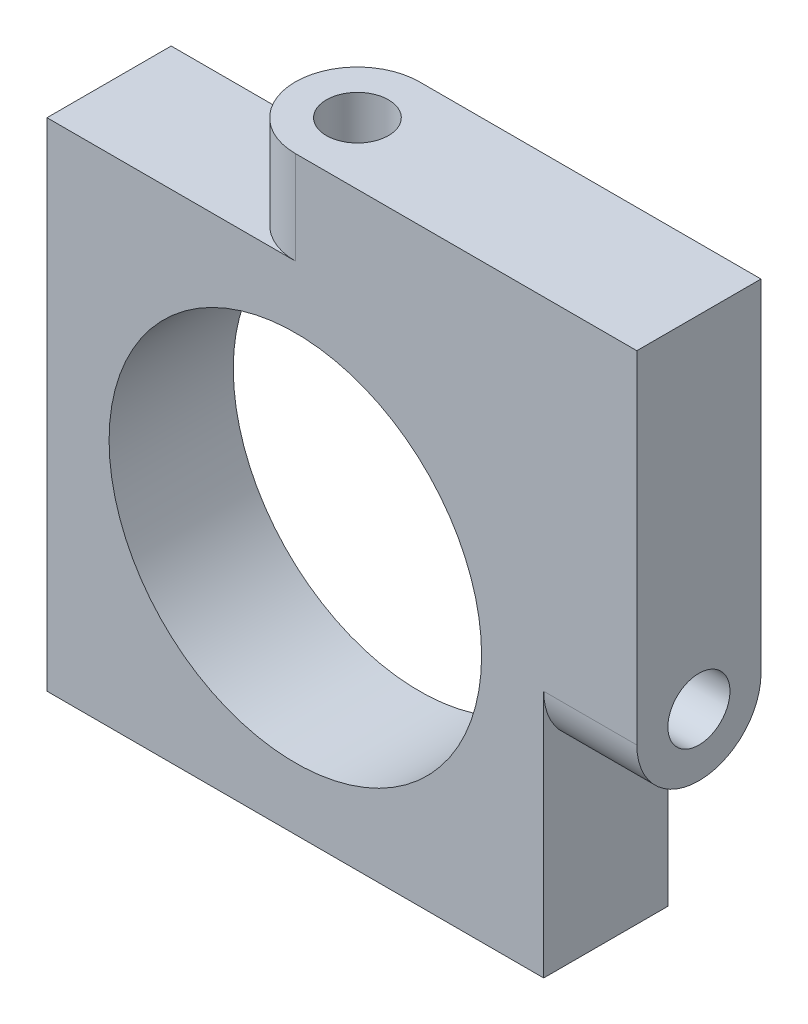
ISO-10303-21;
HEADER;
FILE_DESCRIPTION(('STEP AP214'),'2;1');
FILE_NAME('part.step','',(''),(''),'','','');
FILE_SCHEMA(('AUTOMOTIVE_DESIGN { 1 0 10303 214 1 1 1 1 }'));
ENDSEC;
DATA;
#1=APPLICATION_CONTEXT('core data for automotive mechanical design processes');
#2=APPLICATION_PROTOCOL_DEFINITION('international standard','automotive_design',2000,#1);
#3=PRODUCT_CONTEXT('',#1,'mechanical');
#4=PRODUCT('Part','Part','',(#3));
#5=PRODUCT_RELATED_PRODUCT_CATEGORY('part','',(#4));
#6=PRODUCT_DEFINITION_FORMATION('','',#4);
#7=PRODUCT_DEFINITION_CONTEXT('part definition',#1,'design');
#8=PRODUCT_DEFINITION('design','',#6,#7);
#9=PRODUCT_DEFINITION_SHAPE('','',#8);
#10=(LENGTH_UNIT() NAMED_UNIT(*) SI_UNIT(.MILLI.,.METRE.));
#11=(NAMED_UNIT(*) PLANE_ANGLE_UNIT() SI_UNIT($,.RADIAN.));
#12=(NAMED_UNIT(*) SI_UNIT($,.STERADIAN.) SOLID_ANGLE_UNIT());
#13=UNCERTAINTY_MEASURE_WITH_UNIT(LENGTH_MEASURE(1.E-05),#10,'distance_accuracy_value','');
#14=(GEOMETRIC_REPRESENTATION_CONTEXT(3) GLOBAL_UNCERTAINTY_ASSIGNED_CONTEXT((#13)) GLOBAL_UNIT_ASSIGNED_CONTEXT((#10,
#11,#12)) REPRESENTATION_CONTEXT('',''));
#15=CARTESIAN_POINT('',(0.,0.,0.));
#16=DIRECTION('',(0.,0.,1.));
#17=DIRECTION('',(1.,0.,0.));
#18=AXIS2_PLACEMENT_3D('',#15,#16,#17);
#19=CARTESIAN_POINT('',(0.,0.,25.4));
#20=DIRECTION('',(0.,0.,-1.));
#21=DIRECTION('',(-1.,0.,0.));
#22=AXIS2_PLACEMENT_3D('',#19,#20,#21);
#23=PLANE('',#22);
#24=DIRECTION('',(0.,-1.,0.));
#25=VECTOR('',#24,1.);
#26=CARTESIAN_POINT('',(0.,0.,25.4));
#27=LINE('',#26,#25);
#28=CARTESIAN_POINT('',(0.,101.6,25.4));
#29=VERTEX_POINT('',#28);
#30=CARTESIAN_POINT('',(0.,0.,25.4));
#31=VERTEX_POINT('',#30);
#32=EDGE_CURVE('E155',#29,#31,#27,.T.);
#33=ORIENTED_EDGE('',*,*,#32,.T.);
#34=DIRECTION('',(1.,0.,0.));
#35=VECTOR('',#34,1.);
#36=CARTESIAN_POINT('',(0.,0.,25.4));
#37=LINE('',#36,#35);
#38=CARTESIAN_POINT('',(101.6,0.,25.4));
#39=VERTEX_POINT('',#38);
#40=EDGE_CURVE('E157',#31,#39,#37,.T.);
#41=ORIENTED_EDGE('',*,*,#40,.T.);
#42=DIRECTION('',(0.,1.,0.));
#43=VECTOR('',#42,1.);
#44=CARTESIAN_POINT('',(101.6,0.,25.4));
#45=LINE('',#44,#43);
#46=CARTESIAN_POINT('',(101.6,50.8,25.4));
#47=VERTEX_POINT('',#46);
#48=EDGE_CURVE('E123',#39,#47,#45,.T.);
#49=ORIENTED_EDGE('',*,*,#48,.T.);
#50=DIRECTION('',(-1.,0.,0.));
#51=VECTOR('',#50,1.);
#52=CARTESIAN_POINT('',(120.65,50.8,25.4));
#53=LINE('',#52,#51);
#54=CARTESIAN_POINT('',(120.65,50.8,25.4));
#55=VERTEX_POINT('',#54);
#56=EDGE_CURVE('E103',#55,#47,#53,.T.);
#57=ORIENTED_EDGE('',*,*,#56,.F.);
#58=DIRECTION('',(0.,-1.,0.));
#59=VECTOR('',#58,1.);
#60=CARTESIAN_POINT('',(120.65,0.,25.4));
#61=LINE('',#60,#59);
#62=CARTESIAN_POINT('',(120.65,120.65,25.4));
#63=VERTEX_POINT('',#62);
#64=EDGE_CURVE('E110',#63,#55,#61,.T.);
#65=ORIENTED_EDGE('',*,*,#64,.F.);
#66=DIRECTION('',(1.,0.,0.));
#67=VECTOR('',#66,1.);
#68=CARTESIAN_POINT('',(0.,120.65,25.4));
#69=LINE('',#68,#67);
#70=CARTESIAN_POINT('',(50.8,120.65,25.4));
#71=VERTEX_POINT('',#70);
#72=EDGE_CURVE('E139',#71,#63,#69,.T.);
#73=ORIENTED_EDGE('',*,*,#72,.F.);
#74=DIRECTION('',(0.,-1.,0.));
#75=VECTOR('',#74,1.);
#76=CARTESIAN_POINT('',(50.8,120.65,25.4));
#77=LINE('',#76,#75);
#78=CARTESIAN_POINT('',(50.8,101.6,25.4));
#79=VERTEX_POINT('',#78);
#80=EDGE_CURVE('E140',#71,#79,#77,.T.);
#81=ORIENTED_EDGE('',*,*,#80,.T.);
#82=DIRECTION('',(-1.,0.,0.));
#83=VECTOR('',#82,1.);
#84=CARTESIAN_POINT('',(0.,101.6,25.4));
#85=LINE('',#84,#83);
#86=EDGE_CURVE('E161',#79,#29,#85,.T.);
#87=ORIENTED_EDGE('',*,*,#86,.T.);
#88=EDGE_LOOP('',(#33,#41,#49,#57,#65,#73,#81,#87));
#89=FACE_BOUND('',#88,.T.);
#90=CARTESIAN_POINT('',(50.8,50.8,25.4));
#91=DIRECTION('',(0.,0.,1.));
#92=DIRECTION('',(1.,0.,0.));
#93=AXIS2_PLACEMENT_3D('',#90,#91,#92);
#94=CIRCLE('',#93,38.1);
#95=CARTESIAN_POINT('',(88.9,50.8,25.4));
#96=VERTEX_POINT('',#95);
#97=EDGE_CURVE('E149',#96,#96,#94,.T.);
#98=ORIENTED_EDGE('',*,*,#97,.F.);
#99=EDGE_LOOP('',(#98));
#100=FACE_BOUND('',#99,.T.);
#101=ADVANCED_FACE('F33',(#89,#100),#23,.F.);
#102=CARTESIAN_POINT('',(0.,0.,0.));
#103=DIRECTION('',(0.,0.,-1.));
#104=DIRECTION('',(-1.,0.,0.));
#105=AXIS2_PLACEMENT_3D('',#102,#103,#104);
#106=PLANE('',#105);
#107=DIRECTION('',(0.,-1.,0.));
#108=VECTOR('',#107,1.);
#109=CARTESIAN_POINT('',(0.,0.,0.));
#110=LINE('',#109,#108);
#111=CARTESIAN_POINT('',(0.,101.6,0.));
#112=VERTEX_POINT('',#111);
#113=CARTESIAN_POINT('',(0.,0.,0.));
#114=VERTEX_POINT('',#113);
#115=EDGE_CURVE('E152',#112,#114,#110,.T.);
#116=ORIENTED_EDGE('',*,*,#115,.F.);
#117=DIRECTION('',(-1.,0.,0.));
#118=VECTOR('',#117,1.);
#119=CARTESIAN_POINT('',(0.,101.6,0.));
#120=LINE('',#119,#118);
#121=CARTESIAN_POINT('',(50.8,101.6,0.));
#122=VERTEX_POINT('',#121);
#123=EDGE_CURVE('E158',#122,#112,#120,.T.);
#124=ORIENTED_EDGE('',*,*,#123,.F.);
#125=DIRECTION('',(0.,-1.,0.));
#126=VECTOR('',#125,1.);
#127=CARTESIAN_POINT('',(50.8,120.65,0.));
#128=LINE('',#127,#126);
#129=CARTESIAN_POINT('',(50.8,120.65,0.));
#130=VERTEX_POINT('',#129);
#131=EDGE_CURVE('E145',#130,#122,#128,.T.);
#132=ORIENTED_EDGE('',*,*,#131,.F.);
#133=DIRECTION('',(-1.,0.,0.));
#134=VECTOR('',#133,1.);
#135=CARTESIAN_POINT('',(0.,120.65,0.));
#136=LINE('',#135,#134);
#137=CARTESIAN_POINT('',(120.65,120.65,0.));
#138=VERTEX_POINT('',#137);
#139=EDGE_CURVE('E134',#138,#130,#136,.T.);
#140=ORIENTED_EDGE('',*,*,#139,.F.);
#141=DIRECTION('',(0.,1.,0.));
#142=VECTOR('',#141,1.);
#143=CARTESIAN_POINT('',(120.65,0.,0.));
#144=LINE('',#143,#142);
#145=CARTESIAN_POINT('',(120.65,50.8,0.));
#146=VERTEX_POINT('',#145);
#147=EDGE_CURVE('E109',#146,#138,#144,.T.);
#148=ORIENTED_EDGE('',*,*,#147,.F.);
#149=DIRECTION('',(-1.,0.,0.));
#150=VECTOR('',#149,1.);
#151=CARTESIAN_POINT('',(120.65,50.8,0.));
#152=LINE('',#151,#150);
#153=CARTESIAN_POINT('',(101.6,50.8,0.));
#154=VERTEX_POINT('',#153);
#155=EDGE_CURVE('E105',#146,#154,#152,.T.);
#156=ORIENTED_EDGE('',*,*,#155,.T.);
#157=DIRECTION('',(0.,1.,0.));
#158=VECTOR('',#157,1.);
#159=CARTESIAN_POINT('',(101.6,0.,0.));
#160=LINE('',#159,#158);
#161=CARTESIAN_POINT('',(101.6,0.,0.));
#162=VERTEX_POINT('',#161);
#163=EDGE_CURVE('E168',#162,#154,#160,.T.);
#164=ORIENTED_EDGE('',*,*,#163,.F.);
#165=DIRECTION('',(1.,0.,0.));
#166=VECTOR('',#165,1.);
#167=CARTESIAN_POINT('',(0.,0.,0.));
#168=LINE('',#167,#166);
#169=EDGE_CURVE('E166',#114,#162,#168,.T.);
#170=ORIENTED_EDGE('',*,*,#169,.F.);
#171=EDGE_LOOP('',(#116,#124,#132,#140,#148,#156,#164,#170));
#172=FACE_BOUND('',#171,.T.);
#173=CARTESIAN_POINT('',(50.8,50.8,0.));
#174=DIRECTION('',(0.,0.,1.));
#175=DIRECTION('',(1.,0.,0.));
#176=AXIS2_PLACEMENT_3D('',#173,#174,#175);
#177=CIRCLE('',#176,38.1);
#178=CARTESIAN_POINT('',(88.9,50.8,0.));
#179=VERTEX_POINT('',#178);
#180=EDGE_CURVE('E148',#179,#179,#177,.T.);
#181=ORIENTED_EDGE('',*,*,#180,.T.);
#182=EDGE_LOOP('',(#181));
#183=FACE_BOUND('',#182,.T.);
#184=ADVANCED_FACE('F179',(#172,#183),#106,.T.);
#185=CARTESIAN_POINT('',(0.,0.,25.4));
#186=DIRECTION('',(1.,0.,0.));
#187=DIRECTION('',(0.,0.,-1.));
#188=AXIS2_PLACEMENT_3D('',#185,#186,#187);
#189=PLANE('',#188);
#190=ORIENTED_EDGE('',*,*,#115,.T.);
#191=DIRECTION('',(0.,0.,-1.));
#192=VECTOR('',#191,1.);
#193=CARTESIAN_POINT('',(0.,0.,25.4));
#194=LINE('',#193,#192);
#195=EDGE_CURVE('E11',#31,#114,#194,.T.);
#196=ORIENTED_EDGE('',*,*,#195,.F.);
#197=ORIENTED_EDGE('',*,*,#32,.F.);
#198=DIRECTION('',(0.,0.,-1.));
#199=VECTOR('',#198,1.);
#200=CARTESIAN_POINT('',(0.,101.6,25.4));
#201=LINE('',#200,#199);
#202=EDGE_CURVE('E163',#29,#112,#201,.T.);
#203=ORIENTED_EDGE('',*,*,#202,.T.);
#204=EDGE_LOOP('',(#190,#196,#197,#203));
#205=FACE_BOUND('',#204,.T.);
#206=ADVANCED_FACE('F35',(#205),#189,.F.);
#207=CARTESIAN_POINT('',(0.,0.,25.4));
#208=DIRECTION('',(0.,1.,0.));
#209=DIRECTION('',(0.,0.,1.));
#210=AXIS2_PLACEMENT_3D('',#207,#208,#209);
#211=PLANE('',#210);
#212=ORIENTED_EDGE('',*,*,#169,.T.);
#213=DIRECTION('',(0.,0.,-1.));
#214=VECTOR('',#213,1.);
#215=CARTESIAN_POINT('',(101.6,0.,25.4));
#216=LINE('',#215,#214);
#217=EDGE_CURVE('E41',#39,#162,#216,.T.);
#218=ORIENTED_EDGE('',*,*,#217,.F.);
#219=ORIENTED_EDGE('',*,*,#40,.F.);
#220=ORIENTED_EDGE('',*,*,#195,.T.);
#221=EDGE_LOOP('',(#212,#218,#219,#220));
#222=FACE_BOUND('',#221,.T.);
#223=ADVANCED_FACE('F219',(#222),#211,.F.);
#224=CARTESIAN_POINT('',(101.6,0.,25.4));
#225=DIRECTION('',(-1.,0.,0.));
#226=DIRECTION('',(0.,0.,1.));
#227=AXIS2_PLACEMENT_3D('',#224,#225,#226);
#228=PLANE('',#227);
#229=CARTESIAN_POINT('',(101.6,50.8,12.7));
#230=DIRECTION('',(1.,0.,0.));
#231=DIRECTION('',(0.,0.,-1.));
#232=AXIS2_PLACEMENT_3D('',#229,#230,#231);
#233=CIRCLE('',#232,12.7);
#234=EDGE_CURVE('E48',#47,#154,#233,.T.);
#235=ORIENTED_EDGE('',*,*,#234,.F.);
#236=ORIENTED_EDGE('',*,*,#48,.F.);
#237=ORIENTED_EDGE('',*,*,#217,.T.);
#238=ORIENTED_EDGE('',*,*,#163,.T.);
#239=EDGE_LOOP('',(#235,#236,#237,#238));
#240=FACE_BOUND('',#239,.T.);
#241=ADVANCED_FACE('F175',(#240),#228,.F.);
#242=CARTESIAN_POINT('',(0.,101.6,25.4));
#243=DIRECTION('',(0.,-1.,0.));
#244=DIRECTION('',(0.,0.,-1.));
#245=AXIS2_PLACEMENT_3D('',#242,#243,#244);
#246=PLANE('',#245);
#247=CARTESIAN_POINT('',(50.8,101.6,12.7));
#248=DIRECTION('',(0.,1.,0.));
#249=DIRECTION('',(0.,0.,1.));
#250=AXIS2_PLACEMENT_3D('',#247,#248,#249);
#251=CIRCLE('',#250,12.7);
#252=EDGE_CURVE('E56',#122,#79,#251,.T.);
#253=ORIENTED_EDGE('',*,*,#252,.F.);
#254=ORIENTED_EDGE('',*,*,#123,.T.);
#255=ORIENTED_EDGE('',*,*,#202,.F.);
#256=ORIENTED_EDGE('',*,*,#86,.F.);
#257=EDGE_LOOP('',(#253,#254,#255,#256));
#258=FACE_BOUND('',#257,.T.);
#259=ADVANCED_FACE('F215',(#258),#246,.F.);
#260=CARTESIAN_POINT('',(50.8,50.8,25.4));
#261=DIRECTION('',(0.,0.,-1.));
#262=DIRECTION('',(-1.,0.,0.));
#263=AXIS2_PLACEMENT_3D('',#260,#261,#262);
#264=CYLINDRICAL_SURFACE('',#263,38.1);
#265=ORIENTED_EDGE('',*,*,#97,.T.);
#266=EDGE_LOOP('',(#265));
#267=FACE_BOUND('',#266,.T.);
#268=ORIENTED_EDGE('',*,*,#180,.F.);
#269=EDGE_LOOP('',(#268));
#270=FACE_BOUND('',#269,.T.);
#271=ADVANCED_FACE('F212',(#267,#270),#264,.F.);
#272=CARTESIAN_POINT('',(50.8,120.65,12.7));
#273=DIRECTION('',(0.,-1.,0.));
#274=DIRECTION('',(0.,0.,-1.));
#275=AXIS2_PLACEMENT_3D('',#272,#273,#274);
#276=CYLINDRICAL_SURFACE('',#275,12.7);
#277=ORIENTED_EDGE('',*,*,#252,.T.);
#278=ORIENTED_EDGE('',*,*,#80,.F.);
#279=CARTESIAN_POINT('',(50.8,120.65,12.7));
#280=DIRECTION('',(0.,1.,0.));
#281=DIRECTION('',(0.,0.,1.));
#282=AXIS2_PLACEMENT_3D('',#279,#280,#281);
#283=CIRCLE('',#282,12.7);
#284=EDGE_CURVE('E137',#130,#71,#283,.T.);
#285=ORIENTED_EDGE('',*,*,#284,.F.);
#286=ORIENTED_EDGE('',*,*,#131,.T.);
#287=EDGE_LOOP('',(#277,#278,#285,#286));
#288=FACE_BOUND('',#287,.T.);
#289=ADVANCED_FACE('F229',(#288),#276,.T.);
#290=CARTESIAN_POINT('',(50.8,120.65,12.7));
#291=DIRECTION('',(0.,-1.,0.));
#292=DIRECTION('',(0.,0.,-1.));
#293=AXIS2_PLACEMENT_3D('',#290,#291,#292);
#294=CYLINDRICAL_SURFACE('',#293,6.35);
#295=CARTESIAN_POINT('',(50.8,120.65,12.7));
#296=DIRECTION('',(0.,1.,0.));
#297=DIRECTION('',(0.,0.,1.));
#298=AXIS2_PLACEMENT_3D('',#295,#296,#297);
#299=CIRCLE('',#298,6.35);
#300=CARTESIAN_POINT('',(50.8,120.65,6.35));
#301=VERTEX_POINT('',#300);
#302=EDGE_CURVE('E131',#301,#301,#299,.T.);
#303=CARTESIAN_POINT('',(50.8,101.6,12.7));
#304=DIRECTION('',(0.,1.,0.));
#305=DIRECTION('',(0.,0.,1.));
#306=AXIS2_PLACEMENT_3D('',#303,#304,#305);
#307=CIRCLE('',#306,6.35);
#308=CARTESIAN_POINT('',(50.8,101.6,6.35));
#309=VERTEX_POINT('',#308);
#310=EDGE_CURVE('E124',#309,#309,#307,.T.);
#311=CARTESIAN_POINT('',(50.8,120.65,6.35));
#312=CARTESIAN_POINT('',(50.8,120.4515625,6.35));
#313=CARTESIAN_POINT('',(50.8,120.253125,6.35));
#314=CARTESIAN_POINT('',(50.8,119.85625,6.35));
#315=CARTESIAN_POINT('',(50.8,119.6578125,6.35));
#316=CARTESIAN_POINT('',(50.8,119.2609375,6.35));
#317=CARTESIAN_POINT('',(50.8,119.0625,6.35));
#318=CARTESIAN_POINT('',(50.8,118.665625,6.35));
#319=CARTESIAN_POINT('',(50.8,118.4671875,6.35));
#320=CARTESIAN_POINT('',(50.8,118.0703125,6.35));
#321=CARTESIAN_POINT('',(50.8,117.871875,6.35));
#322=CARTESIAN_POINT('',(50.8,117.475,6.35));
#323=CARTESIAN_POINT('',(50.8,117.2765625,6.35));
#324=CARTESIAN_POINT('',(50.8,116.8796875,6.35));
#325=CARTESIAN_POINT('',(50.8,116.68125,6.35));
#326=CARTESIAN_POINT('',(50.8,116.284375,6.35));
#327=CARTESIAN_POINT('',(50.8,116.0859375,6.35));
#328=CARTESIAN_POINT('',(50.8,115.6890625,6.35));
#329=CARTESIAN_POINT('',(50.8,115.490625,6.35));
#330=CARTESIAN_POINT('',(50.8,115.09375,6.35));
#331=CARTESIAN_POINT('',(50.8,114.8953125,6.35));
#332=CARTESIAN_POINT('',(50.8,114.4984375,6.35));
#333=CARTESIAN_POINT('',(50.8,114.3,6.35));
#334=CARTESIAN_POINT('',(50.8,113.903125,6.35));
#335=CARTESIAN_POINT('',(50.8,113.7046875,6.35));
#336=CARTESIAN_POINT('',(50.8,113.3078125,6.35));
#337=CARTESIAN_POINT('',(50.8,113.109375,6.35));
#338=CARTESIAN_POINT('',(50.8,112.7125,6.35));
#339=CARTESIAN_POINT('',(50.8,112.5140625,6.35));
#340=CARTESIAN_POINT('',(50.8,112.1171875,6.35));
#341=CARTESIAN_POINT('',(50.8,111.91875,6.35));
#342=CARTESIAN_POINT('',(50.8,111.521875,6.35));
#343=CARTESIAN_POINT('',(50.8,111.3234375,6.35));
#344=CARTESIAN_POINT('',(50.8,110.9265625,6.35));
#345=CARTESIAN_POINT('',(50.8,110.728125,6.35));
#346=CARTESIAN_POINT('',(50.8,110.33125,6.35));
#347=CARTESIAN_POINT('',(50.8,110.1328125,6.35));
#348=CARTESIAN_POINT('',(50.8,109.7359375,6.35));
#349=CARTESIAN_POINT('',(50.8,109.5375,6.35));
#350=CARTESIAN_POINT('',(50.8,109.140625,6.35));
#351=CARTESIAN_POINT('',(50.8,108.9421875,6.35));
#352=CARTESIAN_POINT('',(50.8,108.5453125,6.35));
#353=CARTESIAN_POINT('',(50.8,108.346875,6.35));
#354=CARTESIAN_POINT('',(50.8,107.95,6.35));
#355=CARTESIAN_POINT('',(50.8,107.7515625,6.35));
#356=CARTESIAN_POINT('',(50.8,107.3546875,6.35));
#357=CARTESIAN_POINT('',(50.8,107.15625,6.35));
#358=CARTESIAN_POINT('',(50.8,106.759375,6.35));
#359=CARTESIAN_POINT('',(50.8,106.5609375,6.35));
#360=CARTESIAN_POINT('',(50.8,106.1640625,6.35));
#361=CARTESIAN_POINT('',(50.8,105.965625,6.35));
#362=CARTESIAN_POINT('',(50.8,105.56875,6.35));
#363=CARTESIAN_POINT('',(50.8,105.3703125,6.35));
#364=CARTESIAN_POINT('',(50.8,104.9734375,6.35));
#365=CARTESIAN_POINT('',(50.8,104.775,6.35));
#366=CARTESIAN_POINT('',(50.8,104.378125,6.35));
#367=CARTESIAN_POINT('',(50.8,104.1796875,6.35));
#368=CARTESIAN_POINT('',(50.8,103.7828125,6.35));
#369=CARTESIAN_POINT('',(50.8,103.584375,6.35));
#370=CARTESIAN_POINT('',(50.8,103.1875,6.35));
#371=CARTESIAN_POINT('',(50.8,102.9890625,6.35));
#372=CARTESIAN_POINT('',(50.8,102.5921875,6.35));
#373=CARTESIAN_POINT('',(50.8,102.39375,6.35));
#374=CARTESIAN_POINT('',(50.8,101.996875,6.35));
#375=CARTESIAN_POINT('',(50.8,101.7984375,6.35));
#376=CARTESIAN_POINT('',(50.8,101.6,6.35));
#377=B_SPLINE_CURVE_WITH_KNOTS('',3,(#311,#312,#313,#314,#315,#316,#317,#318,#319,#320,#321,
#322,#323,#324,#325,#326,#327,#328,#329,#330,#331,#332,#333,#334,#335,#336,#337,#338,#339,#340,
#341,#342,#343,#344,#345,#346,#347,#348,#349,#350,#351,#352,#353,#354,#355,#356,#357,#358,#359,
#360,#361,#362,#363,#364,#365,#366,#367,#368,#369,#370,#371,#372,#373,#374,#375,#376),
.UNSPECIFIED.,.F.,.F.,(4,2,2,2,2,2,2,2,2,2,2,2,2,2,2,2,2,2,2,2,2,2,2,2,2,2,2,2,2,2,2,2,4),(0.,
0.595312499999986,1.19062499999999,1.78593749999999,2.38124999999999,2.97656249999999,
3.57187499999999,4.16718749999999,4.76249999999999,5.35781249999999,5.95312499999999,
6.54843749999999,7.14374999999999,7.73906249999999,8.33437499999999,8.92968749999999,
9.52499999999999,10.1203125,10.715625,11.3109375,11.90625,12.5015625,13.096875,13.6921875,
14.2875,14.8828125,15.478125,16.0734375,16.66875,17.2640625,17.859375,18.4546875,19.05),.UNSPECIFIED.);
#378=EDGE_CURVE('BSEAM234',#301,#309,#377,.T.);
#379=ORIENTED_EDGE('',*,*,#302,.T.);
#380=ORIENTED_EDGE('',*,*,#310,.F.);
#381=ORIENTED_EDGE('',*,*,#378,.T.);
#382=ORIENTED_EDGE('',*,*,#378,.F.);
#383=EDGE_LOOP('',(#379,#381,#380,#382));
#384=FACE_BOUND('',#383,.T.);
#385=ADVANCED_FACE('F234',(#384),#294,.F.);
#386=CARTESIAN_POINT('',(0.,120.65,0.));
#387=DIRECTION('',(0.,1.,0.));
#388=DIRECTION('',(0.,0.,1.));
#389=AXIS2_PLACEMENT_3D('',#386,#387,#388);
#390=PLANE('',#389);
#391=ORIENTED_EDGE('',*,*,#302,.F.);
#392=EDGE_LOOP('',(#391));
#393=FACE_BOUND('',#392,.T.);
#394=ORIENTED_EDGE('',*,*,#139,.T.);
#395=ORIENTED_EDGE('',*,*,#284,.T.);
#396=ORIENTED_EDGE('',*,*,#72,.T.);
#397=DIRECTION('',(0.,0.,1.));
#398=VECTOR('',#397,1.);
#399=CARTESIAN_POINT('',(120.65,120.65,0.));
#400=LINE('',#399,#398);
#401=EDGE_CURVE('E116',#138,#63,#400,.T.);
#402=ORIENTED_EDGE('',*,*,#401,.F.);
#403=EDGE_LOOP('',(#394,#395,#396,#402));
#404=FACE_BOUND('',#403,.T.);
#405=ADVANCED_FACE('F232',(#393,#404),#390,.T.);
#406=ORIENTED_EDGE('',*,*,#310,.T.);
#407=EDGE_LOOP('',(#406));
#408=FACE_BOUND('',#407,.T.);
#409=ADVANCED_FACE('F217',(#408),#246,.F.);
#410=CARTESIAN_POINT('',(120.65,50.8,12.7));
#411=DIRECTION('',(-1.,0.,0.));
#412=DIRECTION('',(0.,0.,1.));
#413=AXIS2_PLACEMENT_3D('',#410,#411,#412);
#414=CYLINDRICAL_SURFACE('',#413,12.7);
#415=ORIENTED_EDGE('',*,*,#234,.T.);
#416=ORIENTED_EDGE('',*,*,#155,.F.);
#417=CARTESIAN_POINT('',(120.65,50.8,12.7));
#418=DIRECTION('',(1.,0.,0.));
#419=DIRECTION('',(0.,0.,-1.));
#420=AXIS2_PLACEMENT_3D('',#417,#418,#419);
#421=CIRCLE('',#420,12.7);
#422=EDGE_CURVE('E99',#55,#146,#421,.T.);
#423=ORIENTED_EDGE('',*,*,#422,.F.);
#424=ORIENTED_EDGE('',*,*,#56,.T.);
#425=EDGE_LOOP('',(#415,#416,#423,#424));
#426=FACE_BOUND('',#425,.T.);
#427=ADVANCED_FACE('F101',(#426),#414,.T.);
#428=CARTESIAN_POINT('',(120.65,50.8,12.7));
#429=DIRECTION('',(-1.,0.,0.));
#430=DIRECTION('',(0.,0.,1.));
#431=AXIS2_PLACEMENT_3D('',#428,#429,#430);
#432=CYLINDRICAL_SURFACE('',#431,6.35);
#433=CARTESIAN_POINT('',(120.65,50.8,12.7));
#434=DIRECTION('',(1.,0.,0.));
#435=DIRECTION('',(0.,0.,-1.));
#436=AXIS2_PLACEMENT_3D('',#433,#434,#435);
#437=CIRCLE('',#436,6.35);
#438=CARTESIAN_POINT('',(120.65,50.8,19.05));
#439=VERTEX_POINT('',#438);
#440=EDGE_CURVE('E119',#439,#439,#437,.T.);
#441=CARTESIAN_POINT('',(101.6,50.8,12.7));
#442=DIRECTION('',(1.,0.,0.));
#443=DIRECTION('',(0.,0.,-1.));
#444=AXIS2_PLACEMENT_3D('',#441,#442,#443);
#445=CIRCLE('',#444,6.35);
#446=CARTESIAN_POINT('',(101.6,50.8,19.05));
#447=VERTEX_POINT('',#446);
#448=EDGE_CURVE('E185',#447,#447,#445,.T.);
#449=CARTESIAN_POINT('',(120.65,50.8,19.05));
#450=CARTESIAN_POINT('',(120.4515625,50.8,19.05));
#451=CARTESIAN_POINT('',(120.253125,50.8,19.05));
#452=CARTESIAN_POINT('',(119.85625,50.8,19.05));
#453=CARTESIAN_POINT('',(119.6578125,50.8,19.05));
#454=CARTESIAN_POINT('',(119.2609375,50.8,19.05));
#455=CARTESIAN_POINT('',(119.0625,50.8,19.05));
#456=CARTESIAN_POINT('',(118.665625,50.8,19.05));
#457=CARTESIAN_POINT('',(118.4671875,50.8,19.05));
#458=CARTESIAN_POINT('',(118.0703125,50.8,19.05));
#459=CARTESIAN_POINT('',(117.871875,50.8,19.05));
#460=CARTESIAN_POINT('',(117.475,50.8,19.05));
#461=CARTESIAN_POINT('',(117.2765625,50.8,19.05));
#462=CARTESIAN_POINT('',(116.8796875,50.8,19.05));
#463=CARTESIAN_POINT('',(116.68125,50.8,19.05));
#464=CARTESIAN_POINT('',(116.284375,50.8,19.05));
#465=CARTESIAN_POINT('',(116.0859375,50.8,19.05));
#466=CARTESIAN_POINT('',(115.6890625,50.8,19.05));
#467=CARTESIAN_POINT('',(115.490625,50.8,19.05));
#468=CARTESIAN_POINT('',(115.09375,50.8,19.05));
#469=CARTESIAN_POINT('',(114.8953125,50.8,19.05));
#470=CARTESIAN_POINT('',(114.4984375,50.8,19.05));
#471=CARTESIAN_POINT('',(114.3,50.8,19.05));
#472=CARTESIAN_POINT('',(113.903125,50.8,19.05));
#473=CARTESIAN_POINT('',(113.7046875,50.8,19.05));
#474=CARTESIAN_POINT('',(113.3078125,50.8,19.05));
#475=CARTESIAN_POINT('',(113.109375,50.8,19.05));
#476=CARTESIAN_POINT('',(112.7125,50.8,19.05));
#477=CARTESIAN_POINT('',(112.5140625,50.8,19.05));
#478=CARTESIAN_POINT('',(112.1171875,50.8,19.05));
#479=CARTESIAN_POINT('',(111.91875,50.8,19.05));
#480=CARTESIAN_POINT('',(111.521875,50.8,19.05));
#481=CARTESIAN_POINT('',(111.3234375,50.8,19.05));
#482=CARTESIAN_POINT('',(110.9265625,50.8,19.05));
#483=CARTESIAN_POINT('',(110.728125,50.8,19.05));
#484=CARTESIAN_POINT('',(110.33125,50.8,19.05));
#485=CARTESIAN_POINT('',(110.1328125,50.8,19.05));
#486=CARTESIAN_POINT('',(109.7359375,50.8,19.05));
#487=CARTESIAN_POINT('',(109.5375,50.8,19.05));
#488=CARTESIAN_POINT('',(109.140625,50.8,19.05));
#489=CARTESIAN_POINT('',(108.9421875,50.8,19.05));
#490=CARTESIAN_POINT('',(108.5453125,50.8,19.05));
#491=CARTESIAN_POINT('',(108.346875,50.8,19.05));
#492=CARTESIAN_POINT('',(107.95,50.8,19.05));
#493=CARTESIAN_POINT('',(107.7515625,50.8,19.05));
#494=CARTESIAN_POINT('',(107.3546875,50.8,19.05));
#495=CARTESIAN_POINT('',(107.15625,50.8,19.05));
#496=CARTESIAN_POINT('',(106.759375,50.8,19.05));
#497=CARTESIAN_POINT('',(106.5609375,50.8,19.05));
#498=CARTESIAN_POINT('',(106.1640625,50.8,19.05));
#499=CARTESIAN_POINT('',(105.965625,50.8,19.05));
#500=CARTESIAN_POINT('',(105.56875,50.8,19.05));
#501=CARTESIAN_POINT('',(105.3703125,50.8,19.05));
#502=CARTESIAN_POINT('',(104.9734375,50.8,19.05));
#503=CARTESIAN_POINT('',(104.775,50.8,19.05));
#504=CARTESIAN_POINT('',(104.378125,50.8,19.05));
#505=CARTESIAN_POINT('',(104.1796875,50.8,19.05));
#506=CARTESIAN_POINT('',(103.7828125,50.8,19.05));
#507=CARTESIAN_POINT('',(103.584375,50.8,19.05));
#508=CARTESIAN_POINT('',(103.1875,50.8,19.05));
#509=CARTESIAN_POINT('',(102.9890625,50.8,19.05));
#510=CARTESIAN_POINT('',(102.5921875,50.8,19.05));
#511=CARTESIAN_POINT('',(102.39375,50.8,19.05));
#512=CARTESIAN_POINT('',(101.996875,50.8,19.05));
#513=CARTESIAN_POINT('',(101.7984375,50.8,19.05));
#514=CARTESIAN_POINT('',(101.6,50.8,19.05));
#515=B_SPLINE_CURVE_WITH_KNOTS('',3,(#449,#450,#451,#452,#453,#454,#455,#456,#457,#458,#459,
#460,#461,#462,#463,#464,#465,#466,#467,#468,#469,#470,#471,#472,#473,#474,#475,#476,#477,#478,
#479,#480,#481,#482,#483,#484,#485,#486,#487,#488,#489,#490,#491,#492,#493,#494,#495,#496,#497,
#498,#499,#500,#501,#502,#503,#504,#505,#506,#507,#508,#509,#510,#511,#512,#513,#514),
.UNSPECIFIED.,.F.,.F.,(4,2,2,2,2,2,2,2,2,2,2,2,2,2,2,2,2,2,2,2,2,2,2,2,2,2,2,2,2,2,2,2,4),(0.,
0.595312499999986,1.19062499999999,1.78593749999999,2.38124999999999,2.97656249999999,
3.57187499999999,4.16718749999999,4.76249999999999,5.35781249999999,5.95312499999999,
6.54843749999999,7.14374999999999,7.73906249999999,8.33437499999999,8.92968749999999,
9.52499999999999,10.1203125,10.715625,11.3109375,11.90625,12.5015625,13.096875,13.6921875,
14.2875,14.8828125,15.478125,16.0734375,16.66875,17.2640625,17.859375,18.4546875,19.05),.UNSPECIFIED.);
#516=EDGE_CURVE('BSEAM191',#439,#447,#515,.T.);
#517=ORIENTED_EDGE('',*,*,#440,.T.);
#518=ORIENTED_EDGE('',*,*,#448,.F.);
#519=ORIENTED_EDGE('',*,*,#516,.T.);
#520=ORIENTED_EDGE('',*,*,#516,.F.);
#521=EDGE_LOOP('',(#517,#519,#518,#520));
#522=FACE_BOUND('',#521,.T.);
#523=ADVANCED_FACE('F191',(#522),#432,.F.);
#524=CARTESIAN_POINT('',(120.65,0.,0.));
#525=DIRECTION('',(1.,0.,0.));
#526=DIRECTION('',(0.,0.,-1.));
#527=AXIS2_PLACEMENT_3D('',#524,#525,#526);
#528=PLANE('',#527);
#529=ORIENTED_EDGE('',*,*,#440,.F.);
#530=EDGE_LOOP('',(#529));
#531=FACE_BOUND('',#530,.T.);
#532=ORIENTED_EDGE('',*,*,#64,.T.);
#533=ORIENTED_EDGE('',*,*,#422,.T.);
#534=ORIENTED_EDGE('',*,*,#147,.T.);
#535=ORIENTED_EDGE('',*,*,#401,.T.);
#536=EDGE_LOOP('',(#532,#533,#534,#535));
#537=FACE_BOUND('',#536,.T.);
#538=ADVANCED_FACE('F114',(#531,#537),#528,.T.);
#539=ORIENTED_EDGE('',*,*,#448,.T.);
#540=EDGE_LOOP('',(#539));
#541=FACE_BOUND('',#540,.T.);
#542=ADVANCED_FACE('F195',(#541),#228,.F.);
#543=CLOSED_SHELL('',(#101,#184,#206,#223,#241,#259,#271,#289,#385,#405,#409,#427,#523,#538,#542));
#544=MANIFOLD_SOLID_BREP('B2',#543);
#545=ADVANCED_BREP_SHAPE_REPRESENTATION('',(#18,#544),#14);
#546=SHAPE_DEFINITION_REPRESENTATION(#9,#545);
ENDSEC;
END-ISO-10303-21;
